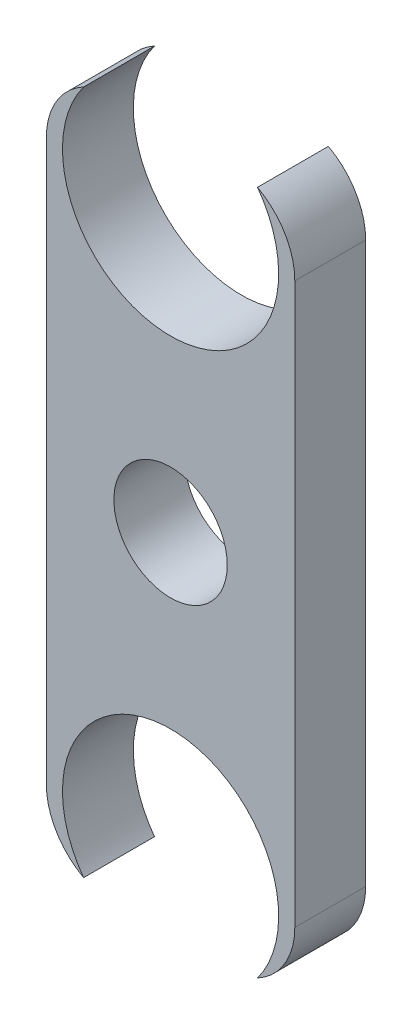
ISO-10303-21;
HEADER;
FILE_DESCRIPTION(('STEP AP214'),'2;1');
FILE_NAME('part.step','',(''),(''),'','','');
FILE_SCHEMA(('AUTOMOTIVE_DESIGN { 1 0 10303 214 1 1 1 1 }'));
ENDSEC;
DATA;
#1=APPLICATION_CONTEXT('core data for automotive mechanical design processes');
#2=APPLICATION_PROTOCOL_DEFINITION('international standard','automotive_design',2000,#1);
#3=PRODUCT_CONTEXT('',#1,'mechanical');
#4=PRODUCT('Part','Part','',(#3));
#5=PRODUCT_RELATED_PRODUCT_CATEGORY('part','',(#4));
#6=PRODUCT_DEFINITION_FORMATION('','',#4);
#7=PRODUCT_DEFINITION_CONTEXT('part definition',#1,'design');
#8=PRODUCT_DEFINITION('design','',#6,#7);
#9=PRODUCT_DEFINITION_SHAPE('','',#8);
#10=(LENGTH_UNIT() NAMED_UNIT(*) SI_UNIT(.MILLI.,.METRE.));
#11=(NAMED_UNIT(*) PLANE_ANGLE_UNIT() SI_UNIT($,.RADIAN.));
#12=(NAMED_UNIT(*) SI_UNIT($,.STERADIAN.) SOLID_ANGLE_UNIT());
#13=UNCERTAINTY_MEASURE_WITH_UNIT(LENGTH_MEASURE(1.E-05),#10,'distance_accuracy_value','');
#14=(GEOMETRIC_REPRESENTATION_CONTEXT(3) GLOBAL_UNCERTAINTY_ASSIGNED_CONTEXT((#13)) GLOBAL_UNIT_ASSIGNED_CONTEXT((#10,
#11,#12)) REPRESENTATION_CONTEXT('',''));
#15=CARTESIAN_POINT('',(0.,0.,0.));
#16=DIRECTION('',(0.,0.,1.));
#17=DIRECTION('',(1.,0.,0.));
#18=AXIS2_PLACEMENT_3D('',#15,#16,#17);
#19=CARTESIAN_POINT('',(0.,39.25,10.));
#20=DIRECTION('',(0.,0.,-1.));
#21=DIRECTION('',(-1.,0.,0.));
#22=AXIS2_PLACEMENT_3D('',#19,#20,#21);
#23=CYLINDRICAL_SURFACE('',#22,15.25);
#24=CARTESIAN_POINT('',(0.,39.25,0.));
#25=DIRECTION('',(0.,0.,1.));
#26=DIRECTION('',(1.,0.,0.));
#27=AXIS2_PLACEMENT_3D('',#24,#25,#26);
#28=CIRCLE('',#27,15.25);
#29=CARTESIAN_POINT('',(12.2653239627321,48.3122474082994,0.));
#30=VERTEX_POINT('',#29);
#31=CARTESIAN_POINT('',(-12.2653239627322,48.3122474082994,0.));
#32=VERTEX_POINT('',#31);
#33=EDGE_CURVE('E165',#30,#32,#28,.F.);
#34=ORIENTED_EDGE('',*,*,#33,.T.);
#35=DIRECTION('',(0.,0.,-1.));
#36=VECTOR('',#35,1.);
#37=CARTESIAN_POINT('',(-12.2653239627322,48.3122474082994,10.));
#38=LINE('',#37,#36);
#39=CARTESIAN_POINT('',(-12.2653239627322,48.3122474082994,10.));
#40=VERTEX_POINT('',#39);
#41=EDGE_CURVE('E118',#40,#32,#38,.T.);
#42=ORIENTED_EDGE('',*,*,#41,.F.);
#43=CARTESIAN_POINT('',(0.,39.25,10.));
#44=DIRECTION('',(0.,0.,1.));
#45=DIRECTION('',(1.,0.,0.));
#46=AXIS2_PLACEMENT_3D('',#43,#44,#45);
#47=CIRCLE('',#46,15.25);
#48=CARTESIAN_POINT('',(12.2653239627321,48.3122474082994,10.));
#49=VERTEX_POINT('',#48);
#50=EDGE_CURVE('E107',#49,#40,#47,.F.);
#51=ORIENTED_EDGE('',*,*,#50,.F.);
#52=DIRECTION('',(0.,0.,-1.));
#53=VECTOR('',#52,1.);
#54=CARTESIAN_POINT('',(12.2653239627321,48.3122474082994,10.));
#55=LINE('',#54,#53);
#56=EDGE_CURVE('E119',#49,#30,#55,.T.);
#57=ORIENTED_EDGE('',*,*,#56,.T.);
#58=EDGE_LOOP('',(#34,#42,#51,#57));
#59=FACE_BOUND('',#58,.T.);
#60=ADVANCED_FACE('F41',(#59),#23,.F.);
#61=CARTESIAN_POINT('',(-17.53020342887,0.,10.));
#62=DIRECTION('',(-1.,0.,0.));
#63=DIRECTION('',(0.,0.,1.));
#64=AXIS2_PLACEMENT_3D('',#61,#62,#63);
#65=PLANE('',#64);
#66=DIRECTION('',(0.,1.,0.));
#67=VECTOR('',#66,1.);
#68=CARTESIAN_POINT('',(-17.53020342887,0.,10.));
#69=LINE('',#68,#67);
#70=CARTESIAN_POINT('',(-17.53020342887,-39.5043740253654,10.));
#71=VERTEX_POINT('',#70);
#72=CARTESIAN_POINT('',(-17.53020342887,39.5043740253654,10.));
#73=VERTEX_POINT('',#72);
#74=EDGE_CURVE('E125',#71,#73,#69,.T.);
#75=ORIENTED_EDGE('',*,*,#74,.T.);
#76=DIRECTION('',(0.,0.,1.));
#77=VECTOR('',#76,1.);
#78=CARTESIAN_POINT('',(-17.53020342887,39.5043740253654,0.));
#79=LINE('',#78,#77);
#80=CARTESIAN_POINT('',(-17.53020342887,39.5043740253654,0.));
#81=VERTEX_POINT('',#80);
#82=EDGE_CURVE('E129',#73,#81,#79,.F.);
#83=ORIENTED_EDGE('',*,*,#82,.T.);
#84=DIRECTION('',(0.,1.,0.));
#85=VECTOR('',#84,1.);
#86=CARTESIAN_POINT('',(-17.53020342887,0.,0.));
#87=LINE('',#86,#85);
#88=CARTESIAN_POINT('',(-17.53020342887,-39.5043740253654,0.));
#89=VERTEX_POINT('',#88);
#90=EDGE_CURVE('E162',#89,#81,#87,.T.);
#91=ORIENTED_EDGE('',*,*,#90,.F.);
#92=DIRECTION('',(0.,0.,1.));
#93=VECTOR('',#92,1.);
#94=CARTESIAN_POINT('',(-17.53020342887,-39.5043740253654,10.));
#95=LINE('',#94,#93);
#96=EDGE_CURVE('E130',#89,#71,#95,.T.);
#97=ORIENTED_EDGE('',*,*,#96,.T.);
#98=EDGE_LOOP('',(#75,#83,#91,#97));
#99=FACE_BOUND('',#98,.T.);
#100=ADVANCED_FACE('F153',(#99),#65,.T.);
#101=CARTESIAN_POINT('',(0.,-39.25,10.));
#102=DIRECTION('',(0.,0.,-1.));
#103=DIRECTION('',(-1.,0.,0.));
#104=AXIS2_PLACEMENT_3D('',#101,#102,#103);
#105=CYLINDRICAL_SURFACE('',#104,15.25);
#106=CARTESIAN_POINT('',(0.,-39.25,0.));
#107=DIRECTION('',(0.,0.,1.));
#108=DIRECTION('',(1.,0.,0.));
#109=AXIS2_PLACEMENT_3D('',#106,#107,#108);
#110=CIRCLE('',#109,15.25);
#111=CARTESIAN_POINT('',(12.2653239627321,-48.3122474082994,0.));
#112=VERTEX_POINT('',#111);
#113=CARTESIAN_POINT('',(-12.2653239627322,-48.3122474082994,0.));
#114=VERTEX_POINT('',#113);
#115=EDGE_CURVE('E167',#112,#114,#110,.T.);
#116=ORIENTED_EDGE('',*,*,#115,.F.);
#117=DIRECTION('',(0.,0.,-1.));
#118=VECTOR('',#117,1.);
#119=CARTESIAN_POINT('',(12.2653239627321,-48.3122474082994,10.));
#120=LINE('',#119,#118);
#121=CARTESIAN_POINT('',(12.2653239627321,-48.3122474082994,10.));
#122=VERTEX_POINT('',#121);
#123=EDGE_CURVE('E178',#122,#112,#120,.T.);
#124=ORIENTED_EDGE('',*,*,#123,.F.);
#125=CARTESIAN_POINT('',(0.,-39.25,10.));
#126=DIRECTION('',(0.,0.,1.));
#127=DIRECTION('',(1.,0.,0.));
#128=AXIS2_PLACEMENT_3D('',#125,#126,#127);
#129=CIRCLE('',#128,15.25);
#130=CARTESIAN_POINT('',(-12.2653239627322,-48.3122474082994,10.));
#131=VERTEX_POINT('',#130);
#132=EDGE_CURVE('E160',#122,#131,#129,.T.);
#133=ORIENTED_EDGE('',*,*,#132,.T.);
#134=DIRECTION('',(0.,0.,-1.));
#135=VECTOR('',#134,1.);
#136=CARTESIAN_POINT('',(-12.2653239627322,-48.3122474082994,10.));
#137=LINE('',#136,#135);
#138=EDGE_CURVE('E132',#131,#114,#137,.T.);
#139=ORIENTED_EDGE('',*,*,#138,.T.);
#140=EDGE_LOOP('',(#116,#124,#133,#139));
#141=FACE_BOUND('',#140,.T.);
#142=ADVANCED_FACE('F181',(#141),#105,.F.);
#143=CARTESIAN_POINT('',(0.,0.,10.));
#144=DIRECTION('',(0.,0.,-1.));
#145=DIRECTION('',(-1.,0.,0.));
#146=AXIS2_PLACEMENT_3D('',#143,#144,#145);
#147=CYLINDRICAL_SURFACE('',#146,8.);
#148=CARTESIAN_POINT('',(0.,0.,10.));
#149=DIRECTION('',(0.,0.,1.));
#150=DIRECTION('',(1.,0.,0.));
#151=AXIS2_PLACEMENT_3D('',#148,#149,#150);
#152=CIRCLE('',#151,8.);
#153=CARTESIAN_POINT('',(8.,0.,10.));
#154=VERTEX_POINT('',#153);
#155=EDGE_CURVE('E121',#154,#154,#152,.T.);
#156=ORIENTED_EDGE('',*,*,#155,.T.);
#157=EDGE_LOOP('',(#156));
#158=FACE_BOUND('',#157,.T.);
#159=CARTESIAN_POINT('',(0.,0.,0.));
#160=DIRECTION('',(0.,0.,1.));
#161=DIRECTION('',(1.,0.,0.));
#162=AXIS2_PLACEMENT_3D('',#159,#160,#161);
#163=CIRCLE('',#162,8.);
#164=CARTESIAN_POINT('',(8.,0.,0.));
#165=VERTEX_POINT('',#164);
#166=EDGE_CURVE('E163',#165,#165,#163,.T.);
#167=ORIENTED_EDGE('',*,*,#166,.F.);
#168=EDGE_LOOP('',(#167));
#169=FACE_BOUND('',#168,.T.);
#170=ADVANCED_FACE('F194',(#158,#169),#147,.F.);
#171=CARTESIAN_POINT('',(17.5302034288699,0.,10.));
#172=DIRECTION('',(-1.,0.,0.));
#173=DIRECTION('',(0.,0.,1.));
#174=AXIS2_PLACEMENT_3D('',#171,#172,#173);
#175=PLANE('',#174);
#176=DIRECTION('',(0.,1.,0.));
#177=VECTOR('',#176,1.);
#178=CARTESIAN_POINT('',(17.5302034288699,0.,10.));
#179=LINE('',#178,#177);
#180=CARTESIAN_POINT('',(17.5302034288699,-39.5043740253654,10.));
#181=VERTEX_POINT('',#180);
#182=CARTESIAN_POINT('',(17.5302034288699,39.5043740253654,10.));
#183=VERTEX_POINT('',#182);
#184=EDGE_CURVE('E109',#181,#183,#179,.T.);
#185=ORIENTED_EDGE('',*,*,#184,.F.);
#186=DIRECTION('',(0.,0.,-1.));
#187=VECTOR('',#186,1.);
#188=CARTESIAN_POINT('',(17.5302034288699,-39.5043740253654,10.));
#189=LINE('',#188,#187);
#190=CARTESIAN_POINT('',(17.5302034288699,-39.5043740253654,0.));
#191=VERTEX_POINT('',#190);
#192=EDGE_CURVE('E11',#181,#191,#189,.T.);
#193=ORIENTED_EDGE('',*,*,#192,.T.);
#194=DIRECTION('',(0.,1.,0.));
#195=VECTOR('',#194,1.);
#196=CARTESIAN_POINT('',(17.5302034288699,0.,0.));
#197=LINE('',#196,#195);
#198=CARTESIAN_POINT('',(17.5302034288699,39.5043740253654,0.));
#199=VERTEX_POINT('',#198);
#200=EDGE_CURVE('E171',#191,#199,#197,.T.);
#201=ORIENTED_EDGE('',*,*,#200,.T.);
#202=DIRECTION('',(0.,0.,-1.));
#203=VECTOR('',#202,1.);
#204=CARTESIAN_POINT('',(17.5302034288699,39.5043740253654,10.));
#205=LINE('',#204,#203);
#206=EDGE_CURVE('E47',#199,#183,#205,.F.);
#207=ORIENTED_EDGE('',*,*,#206,.T.);
#208=EDGE_LOOP('',(#185,#193,#201,#207));
#209=FACE_BOUND('',#208,.T.);
#210=ADVANCED_FACE('F186',(#209),#175,.F.);
#211=CARTESIAN_POINT('',(0.,0.,10.));
#212=DIRECTION('',(0.,0.,1.));
#213=DIRECTION('',(1.,0.,0.));
#214=AXIS2_PLACEMENT_3D('',#211,#212,#213);
#215=PLANE('',#214);
#216=ORIENTED_EDGE('',*,*,#155,.F.);
#217=EDGE_LOOP('',(#216));
#218=FACE_BOUND('',#217,.T.);
#219=ORIENTED_EDGE('',*,*,#50,.T.);
#220=CARTESIAN_POINT('',(-7.53020342886996,39.5043740253654,10.));
#221=DIRECTION('',(0.,0.,1.));
#222=DIRECTION('',(1.,0.,0.));
#223=AXIS2_PLACEMENT_3D('',#220,#221,#222);
#224=CIRCLE('',#223,10.);
#225=EDGE_CURVE('E148',#40,#73,#224,.T.);
#226=ORIENTED_EDGE('',*,*,#225,.T.);
#227=ORIENTED_EDGE('',*,*,#74,.F.);
#228=CARTESIAN_POINT('',(-7.53020342886996,-39.5043740253654,10.));
#229=DIRECTION('',(0.,0.,1.));
#230=DIRECTION('',(1.,0.,0.));
#231=AXIS2_PLACEMENT_3D('',#228,#229,#230);
#232=CIRCLE('',#231,10.);
#233=EDGE_CURVE('E145',#71,#131,#232,.T.);
#234=ORIENTED_EDGE('',*,*,#233,.T.);
#235=ORIENTED_EDGE('',*,*,#132,.F.);
#236=CARTESIAN_POINT('',(7.53020342886994,-39.5043740253654,10.));
#237=DIRECTION('',(0.,0.,1.));
#238=DIRECTION('',(1.,0.,0.));
#239=AXIS2_PLACEMENT_3D('',#236,#237,#238);
#240=CIRCLE('',#239,10.);
#241=EDGE_CURVE('E65',#122,#181,#240,.T.);
#242=ORIENTED_EDGE('',*,*,#241,.T.);
#243=ORIENTED_EDGE('',*,*,#184,.T.);
#244=CARTESIAN_POINT('',(7.53020342886994,39.5043740253654,10.));
#245=DIRECTION('',(0.,0.,1.));
#246=DIRECTION('',(1.,0.,0.));
#247=AXIS2_PLACEMENT_3D('',#244,#245,#246);
#248=CIRCLE('',#247,10.);
#249=EDGE_CURVE('E104',#183,#49,#248,.T.);
#250=ORIENTED_EDGE('',*,*,#249,.T.);
#251=EDGE_LOOP('',(#219,#226,#227,#234,#235,#242,#243,#250));
#252=FACE_BOUND('',#251,.T.);
#253=ADVANCED_FACE('F110',(#218,#252),#215,.T.);
#254=CARTESIAN_POINT('',(0.,0.,0.));
#255=DIRECTION('',(0.,0.,1.));
#256=DIRECTION('',(1.,0.,0.));
#257=AXIS2_PLACEMENT_3D('',#254,#255,#256);
#258=PLANE('',#257);
#259=ORIENTED_EDGE('',*,*,#166,.T.);
#260=EDGE_LOOP('',(#259));
#261=FACE_BOUND('',#260,.T.);
#262=ORIENTED_EDGE('',*,*,#90,.T.);
#263=CARTESIAN_POINT('',(-7.53020342886996,39.5043740253654,0.));
#264=DIRECTION('',(0.,0.,1.));
#265=DIRECTION('',(1.,0.,0.));
#266=AXIS2_PLACEMENT_3D('',#263,#264,#265);
#267=CIRCLE('',#266,10.);
#268=EDGE_CURVE('E114',#81,#32,#267,.F.);
#269=ORIENTED_EDGE('',*,*,#268,.T.);
#270=ORIENTED_EDGE('',*,*,#33,.F.);
#271=CARTESIAN_POINT('',(7.53020342886994,39.5043740253654,0.));
#272=DIRECTION('',(0.,0.,1.));
#273=DIRECTION('',(1.,0.,0.));
#274=AXIS2_PLACEMENT_3D('',#271,#272,#273);
#275=CIRCLE('',#274,10.);
#276=EDGE_CURVE('E124',#30,#199,#275,.F.);
#277=ORIENTED_EDGE('',*,*,#276,.T.);
#278=ORIENTED_EDGE('',*,*,#200,.F.);
#279=CARTESIAN_POINT('',(7.53020342886994,-39.5043740253654,0.));
#280=DIRECTION('',(0.,0.,1.));
#281=DIRECTION('',(1.,0.,0.));
#282=AXIS2_PLACEMENT_3D('',#279,#280,#281);
#283=CIRCLE('',#282,10.);
#284=EDGE_CURVE('E136',#191,#112,#283,.F.);
#285=ORIENTED_EDGE('',*,*,#284,.T.);
#286=ORIENTED_EDGE('',*,*,#115,.T.);
#287=CARTESIAN_POINT('',(-7.53020342886996,-39.5043740253654,0.));
#288=DIRECTION('',(0.,0.,1.));
#289=DIRECTION('',(1.,0.,0.));
#290=AXIS2_PLACEMENT_3D('',#287,#288,#289);
#291=CIRCLE('',#290,10.);
#292=EDGE_CURVE('E139',#114,#89,#291,.F.);
#293=ORIENTED_EDGE('',*,*,#292,.T.);
#294=EDGE_LOOP('',(#262,#269,#270,#277,#278,#285,#286,#293));
#295=FACE_BOUND('',#294,.T.);
#296=ADVANCED_FACE('F161',(#261,#295),#258,.F.);
#297=CARTESIAN_POINT('',(-7.53020342886996,39.5043740253654,10.));
#298=DIRECTION('',(0.,0.,-1.));
#299=DIRECTION('',(-1.,0.,0.));
#300=AXIS2_PLACEMENT_3D('',#297,#298,#299);
#301=CYLINDRICAL_SURFACE('',#300,10.);
#302=ORIENTED_EDGE('',*,*,#225,.F.);
#303=ORIENTED_EDGE('',*,*,#41,.T.);
#304=ORIENTED_EDGE('',*,*,#268,.F.);
#305=ORIENTED_EDGE('',*,*,#82,.F.);
#306=EDGE_LOOP('',(#302,#303,#304,#305));
#307=FACE_BOUND('',#306,.T.);
#308=ADVANCED_FACE('F157',(#307),#301,.T.);
#309=CARTESIAN_POINT('',(-7.53020342886996,-39.5043740253654,10.));
#310=DIRECTION('',(0.,0.,-1.));
#311=DIRECTION('',(-1.,0.,0.));
#312=AXIS2_PLACEMENT_3D('',#309,#310,#311);
#313=CYLINDRICAL_SURFACE('',#312,10.);
#314=ORIENTED_EDGE('',*,*,#233,.F.);
#315=ORIENTED_EDGE('',*,*,#96,.F.);
#316=ORIENTED_EDGE('',*,*,#292,.F.);
#317=ORIENTED_EDGE('',*,*,#138,.F.);
#318=EDGE_LOOP('',(#314,#315,#316,#317));
#319=FACE_BOUND('',#318,.T.);
#320=ADVANCED_FACE('F218',(#319),#313,.T.);
#321=CARTESIAN_POINT('',(7.53020342886994,-39.5043740253654,10.));
#322=DIRECTION('',(0.,0.,-1.));
#323=DIRECTION('',(-1.,0.,0.));
#324=AXIS2_PLACEMENT_3D('',#321,#322,#323);
#325=CYLINDRICAL_SURFACE('',#324,10.);
#326=ORIENTED_EDGE('',*,*,#241,.F.);
#327=ORIENTED_EDGE('',*,*,#123,.T.);
#328=ORIENTED_EDGE('',*,*,#284,.F.);
#329=ORIENTED_EDGE('',*,*,#192,.F.);
#330=EDGE_LOOP('',(#326,#327,#328,#329));
#331=FACE_BOUND('',#330,.T.);
#332=ADVANCED_FACE('F189',(#331),#325,.T.);
#333=CARTESIAN_POINT('',(7.53020342886994,39.5043740253654,10.));
#334=DIRECTION('',(0.,0.,-1.));
#335=DIRECTION('',(-1.,0.,0.));
#336=AXIS2_PLACEMENT_3D('',#333,#334,#335);
#337=CYLINDRICAL_SURFACE('',#336,10.);
#338=ORIENTED_EDGE('',*,*,#249,.F.);
#339=ORIENTED_EDGE('',*,*,#206,.F.);
#340=ORIENTED_EDGE('',*,*,#276,.F.);
#341=ORIENTED_EDGE('',*,*,#56,.F.);
#342=EDGE_LOOP('',(#338,#339,#340,#341));
#343=FACE_BOUND('',#342,.T.);
#344=ADVANCED_FACE('F43',(#343),#337,.T.);
#345=CLOSED_SHELL('',(#60,#100,#142,#170,#210,#253,#296,#308,#320,#332,#344));
#346=MANIFOLD_SOLID_BREP('B2',#345);
#347=ADVANCED_BREP_SHAPE_REPRESENTATION('',(#18,#346),#14);
#348=SHAPE_DEFINITION_REPRESENTATION(#9,#347);
ENDSEC;
END-ISO-10303-21;
